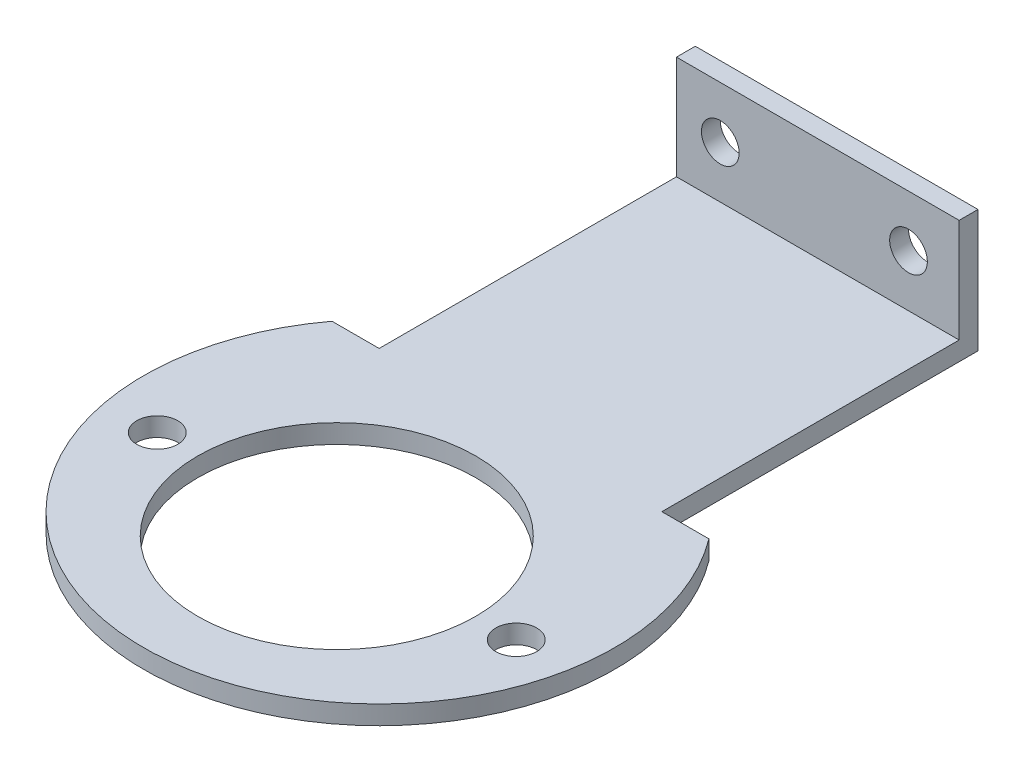
ISO-10303-21;
HEADER;
FILE_DESCRIPTION(('STEP AP214'),'2;1');
FILE_NAME('part.step','',(''),(''),'','','');
FILE_SCHEMA(('AUTOMOTIVE_DESIGN { 1 0 10303 214 1 1 1 1 }'));
ENDSEC;
DATA;
#1=APPLICATION_CONTEXT('core data for automotive mechanical design processes');
#2=APPLICATION_PROTOCOL_DEFINITION('international standard','automotive_design',2000,#1);
#3=PRODUCT_CONTEXT('',#1,'mechanical');
#4=PRODUCT('Part','Part','',(#3));
#5=PRODUCT_RELATED_PRODUCT_CATEGORY('part','',(#4));
#6=PRODUCT_DEFINITION_FORMATION('','',#4);
#7=PRODUCT_DEFINITION_CONTEXT('part definition',#1,'design');
#8=PRODUCT_DEFINITION('design','',#6,#7);
#9=PRODUCT_DEFINITION_SHAPE('','',#8);
#10=(LENGTH_UNIT() NAMED_UNIT(*) SI_UNIT(.MILLI.,.METRE.));
#11=(NAMED_UNIT(*) PLANE_ANGLE_UNIT() SI_UNIT($,.RADIAN.));
#12=(NAMED_UNIT(*) SI_UNIT($,.STERADIAN.) SOLID_ANGLE_UNIT());
#13=UNCERTAINTY_MEASURE_WITH_UNIT(LENGTH_MEASURE(1.E-05),#10,'distance_accuracy_value','');
#14=(GEOMETRIC_REPRESENTATION_CONTEXT(3) GLOBAL_UNCERTAINTY_ASSIGNED_CONTEXT((#13)) GLOBAL_UNIT_ASSIGNED_CONTEXT((#10,
#11,#12)) REPRESENTATION_CONTEXT('',''));
#15=CARTESIAN_POINT('',(0.,0.,0.));
#16=DIRECTION('',(0.,0.,1.));
#17=DIRECTION('',(1.,0.,0.));
#18=AXIS2_PLACEMENT_3D('',#15,#16,#17);
#19=CARTESIAN_POINT('',(-40.,4.,-30.));
#20=DIRECTION('',(0.,0.,1.));
#21=DIRECTION('',(1.,0.,0.));
#22=AXIS2_PLACEMENT_3D('',#19,#20,#21);
#23=PLANE('',#22);
#24=DIRECTION('',(0.,1.,0.));
#25=VECTOR('',#24,1.);
#26=CARTESIAN_POINT('',(-30.,4.,-30.));
#27=LINE('',#26,#25);
#28=CARTESIAN_POINT('',(-30.,0.,-30.));
#29=VERTEX_POINT('',#28);
#30=CARTESIAN_POINT('',(-30.,4.,-30.));
#31=VERTEX_POINT('',#30);
#32=EDGE_CURVE('E137',#29,#31,#27,.T.);
#33=ORIENTED_EDGE('',*,*,#32,.F.);
#34=DIRECTION('',(-1.,0.,0.));
#35=VECTOR('',#34,1.);
#36=CARTESIAN_POINT('',(-40.,0.,-30.));
#37=LINE('',#36,#35);
#38=CARTESIAN_POINT('',(-40.,0.,-30.));
#39=VERTEX_POINT('',#38);
#40=EDGE_CURVE('E199',#29,#39,#37,.T.);
#41=ORIENTED_EDGE('',*,*,#40,.T.);
#42=DIRECTION('',(0.,-1.,0.));
#43=VECTOR('',#42,1.);
#44=CARTESIAN_POINT('',(-40.,4.,-30.));
#45=LINE('',#44,#43);
#46=CARTESIAN_POINT('',(-40.,4.,-30.));
#47=VERTEX_POINT('',#46);
#48=EDGE_CURVE('E55',#47,#39,#45,.T.);
#49=ORIENTED_EDGE('',*,*,#48,.F.);
#50=DIRECTION('',(-1.,0.,0.));
#51=VECTOR('',#50,1.);
#52=CARTESIAN_POINT('',(-40.,4.,-30.));
#53=LINE('',#52,#51);
#54=EDGE_CURVE('E191',#31,#47,#53,.T.);
#55=ORIENTED_EDGE('',*,*,#54,.F.);
#56=EDGE_LOOP('',(#33,#41,#49,#55));
#57=FACE_BOUND('',#56,.T.);
#58=ADVANCED_FACE('F45',(#57),#23,.F.);
#59=DIRECTION('',(0.,-1.,0.));
#60=VECTOR('',#59,1.);
#61=CARTESIAN_POINT('',(30.,4.,-30.));
#62=LINE('',#61,#60);
#63=CARTESIAN_POINT('',(30.,4.,-30.));
#64=VERTEX_POINT('',#63);
#65=CARTESIAN_POINT('',(30.,0.,-30.));
#66=VERTEX_POINT('',#65);
#67=EDGE_CURVE('E141',#64,#66,#62,.T.);
#68=ORIENTED_EDGE('',*,*,#67,.F.);
#69=CARTESIAN_POINT('',(40.,4.,-30.));
#70=VERTEX_POINT('',#69);
#71=EDGE_CURVE('E193',#70,#64,#53,.T.);
#72=ORIENTED_EDGE('',*,*,#71,.F.);
#73=DIRECTION('',(0.,-1.,0.));
#74=VECTOR('',#73,1.);
#75=CARTESIAN_POINT('',(40.,4.,-30.));
#76=LINE('',#75,#74);
#77=CARTESIAN_POINT('',(40.,0.,-30.));
#78=VERTEX_POINT('',#77);
#79=EDGE_CURVE('E11',#70,#78,#76,.T.);
#80=ORIENTED_EDGE('',*,*,#79,.T.);
#81=EDGE_CURVE('E192',#78,#66,#37,.T.);
#82=ORIENTED_EDGE('',*,*,#81,.T.);
#83=EDGE_LOOP('',(#68,#72,#80,#82));
#84=FACE_BOUND('',#83,.T.);
#85=ADVANCED_FACE('F251',(#84),#23,.F.);
#86=CARTESIAN_POINT('',(0.,4.,0.));
#87=DIRECTION('',(0.,-1.,0.));
#88=DIRECTION('',(0.,0.,-1.));
#89=AXIS2_PLACEMENT_3D('',#86,#87,#88);
#90=CYLINDRICAL_SURFACE('',#89,50.);
#91=CARTESIAN_POINT('',(0.,0.,0.));
#92=DIRECTION('',(0.,1.,0.));
#93=DIRECTION('',(0.,0.,-1.));
#94=AXIS2_PLACEMENT_3D('',#91,#92,#93);
#95=CIRCLE('',#94,50.);
#96=EDGE_CURVE('E176',#39,#78,#95,.T.);
#97=ORIENTED_EDGE('',*,*,#96,.T.);
#98=ORIENTED_EDGE('',*,*,#79,.F.);
#99=CARTESIAN_POINT('',(6.03683769639929E-13,4.,1.96023752785379E-13));
#100=DIRECTION('',(0.,1.,0.));
#101=DIRECTION('',(0.,0.,1.));
#102=AXIS2_PLACEMENT_3D('',#99,#100,#101);
#103=CIRCLE('',#102,50.0000000000006);
#104=EDGE_CURVE('E188',#47,#70,#103,.T.);
#105=ORIENTED_EDGE('',*,*,#104,.F.);
#106=ORIENTED_EDGE('',*,*,#48,.T.);
#107=EDGE_LOOP('',(#97,#98,#105,#106));
#108=FACE_BOUND('',#107,.T.);
#109=ADVANCED_FACE('F47',(#108),#90,.T.);
#110=CARTESIAN_POINT('',(6.03683769639929E-13,4.,1.96023752785379E-13));
#111=DIRECTION('',(0.,1.,0.));
#112=DIRECTION('',(0.,0.,1.));
#113=AXIS2_PLACEMENT_3D('',#110,#111,#112);
#114=PLANE('',#113);
#115=CARTESIAN_POINT('',(0.,4.,9.));
#116=DIRECTION('',(0.,1.,0.));
#117=DIRECTION('',(0.,0.,1.));
#118=AXIS2_PLACEMENT_3D('',#115,#116,#117);
#119=CIRCLE('',#118,29.5);
#120=CARTESIAN_POINT('',(0.,4.,38.5));
#121=VERTEX_POINT('',#120);
#122=EDGE_CURVE('E227',#121,#121,#119,.T.);
#123=ORIENTED_EDGE('',*,*,#122,.F.);
#124=EDGE_LOOP('',(#123));
#125=FACE_BOUND('',#124,.T.);
#126=DIRECTION('',(1.,0.,0.));
#127=VECTOR('',#126,1.);
#128=CARTESIAN_POINT('',(-30.,4.,-93.1));
#129=LINE('',#128,#127);
#130=CARTESIAN_POINT('',(-30.,4.,-93.1));
#131=VERTEX_POINT('',#130);
#132=CARTESIAN_POINT('',(30.,4.,-93.1));
#133=VERTEX_POINT('',#132);
#134=EDGE_CURVE('E63',#131,#133,#129,.T.);
#135=ORIENTED_EDGE('',*,*,#134,.F.);
#136=DIRECTION('',(0.,0.,1.));
#137=VECTOR('',#136,1.);
#138=CARTESIAN_POINT('',(-30.,4.,-97.1));
#139=LINE('',#138,#137);
#140=EDGE_CURVE('E67',#131,#31,#139,.T.);
#141=ORIENTED_EDGE('',*,*,#140,.T.);
#142=ORIENTED_EDGE('',*,*,#54,.T.);
#143=ORIENTED_EDGE('',*,*,#104,.T.);
#144=ORIENTED_EDGE('',*,*,#71,.T.);
#145=DIRECTION('',(0.,0.,1.));
#146=VECTOR('',#145,1.);
#147=CARTESIAN_POINT('',(30.,4.,-97.1));
#148=LINE('',#147,#146);
#149=EDGE_CURVE('E166',#133,#64,#148,.T.);
#150=ORIENTED_EDGE('',*,*,#149,.F.);
#151=EDGE_LOOP('',(#135,#141,#142,#143,#144,#150));
#152=FACE_BOUND('',#151,.T.);
#153=CARTESIAN_POINT('',(-38.1,4.,9.00000000000001));
#154=DIRECTION('',(0.,1.,0.));
#155=DIRECTION('',(0.,0.,1.));
#156=AXIS2_PLACEMENT_3D('',#153,#154,#155);
#157=CIRCLE('',#156,4.35);
#158=CARTESIAN_POINT('',(-38.1,4.,13.35));
#159=VERTEX_POINT('',#158);
#160=EDGE_CURVE('E177',#159,#159,#157,.T.);
#161=ORIENTED_EDGE('',*,*,#160,.F.);
#162=EDGE_LOOP('',(#161));
#163=FACE_BOUND('',#162,.T.);
#164=CARTESIAN_POINT('',(38.1,4.,9.00000000000001));
#165=DIRECTION('',(0.,1.,0.));
#166=DIRECTION('',(0.,0.,1.));
#167=AXIS2_PLACEMENT_3D('',#164,#165,#166);
#168=CIRCLE('',#167,4.35);
#169=CARTESIAN_POINT('',(38.1,4.,13.35));
#170=VERTEX_POINT('',#169);
#171=EDGE_CURVE('E181',#170,#170,#168,.T.);
#172=ORIENTED_EDGE('',*,*,#171,.F.);
#173=EDGE_LOOP('',(#172));
#174=FACE_BOUND('',#173,.T.);
#175=ADVANCED_FACE('F262',(#125,#152,#163,#174),#114,.T.);
#176=CARTESIAN_POINT('',(6.03683769639929E-13,0.,1.96023752785379E-13));
#177=DIRECTION('',(0.,1.,0.));
#178=DIRECTION('',(0.,0.,1.));
#179=AXIS2_PLACEMENT_3D('',#176,#177,#178);
#180=PLANE('',#179);
#181=CARTESIAN_POINT('',(0.,0.,9.));
#182=DIRECTION('',(0.,1.,0.));
#183=DIRECTION('',(0.,0.,1.));
#184=AXIS2_PLACEMENT_3D('',#181,#182,#183);
#185=CIRCLE('',#184,29.5);
#186=CARTESIAN_POINT('',(0.,0.,38.5));
#187=VERTEX_POINT('',#186);
#188=EDGE_CURVE('E49',#187,#187,#185,.T.);
#189=ORIENTED_EDGE('',*,*,#188,.T.);
#190=EDGE_LOOP('',(#189));
#191=FACE_BOUND('',#190,.T.);
#192=CARTESIAN_POINT('',(-38.1,0.,9.00000000000001));
#193=DIRECTION('',(0.,1.,0.));
#194=DIRECTION('',(0.,0.,1.));
#195=AXIS2_PLACEMENT_3D('',#192,#193,#194);
#196=CIRCLE('',#195,4.35);
#197=CARTESIAN_POINT('',(-38.1,0.,13.35));
#198=VERTEX_POINT('',#197);
#199=EDGE_CURVE('E172',#198,#198,#196,.T.);
#200=ORIENTED_EDGE('',*,*,#199,.T.);
#201=EDGE_LOOP('',(#200));
#202=FACE_BOUND('',#201,.T.);
#203=CARTESIAN_POINT('',(38.1,0.,9.00000000000001));
#204=DIRECTION('',(0.,1.,0.));
#205=DIRECTION('',(0.,0.,1.));
#206=AXIS2_PLACEMENT_3D('',#203,#204,#205);
#207=CIRCLE('',#206,4.35);
#208=CARTESIAN_POINT('',(38.1,0.,13.35));
#209=VERTEX_POINT('',#208);
#210=EDGE_CURVE('E171',#209,#209,#207,.T.);
#211=ORIENTED_EDGE('',*,*,#210,.T.);
#212=EDGE_LOOP('',(#211));
#213=FACE_BOUND('',#212,.T.);
#214=ORIENTED_EDGE('',*,*,#96,.F.);
#215=ORIENTED_EDGE('',*,*,#40,.F.);
#216=DIRECTION('',(0.,0.,1.));
#217=VECTOR('',#216,1.);
#218=CARTESIAN_POINT('',(-30.,0.,-97.1));
#219=LINE('',#218,#217);
#220=CARTESIAN_POINT('',(-30.,0.,-97.1));
#221=VERTEX_POINT('',#220);
#222=EDGE_CURVE('E154',#221,#29,#219,.T.);
#223=ORIENTED_EDGE('',*,*,#222,.F.);
#224=DIRECTION('',(-1.,0.,0.));
#225=VECTOR('',#224,1.);
#226=CARTESIAN_POINT('',(30.,0.,-97.1));
#227=LINE('',#226,#225);
#228=CARTESIAN_POINT('',(30.,0.,-97.1));
#229=VERTEX_POINT('',#228);
#230=EDGE_CURVE('E152',#229,#221,#227,.T.);
#231=ORIENTED_EDGE('',*,*,#230,.F.);
#232=DIRECTION('',(0.,0.,1.));
#233=VECTOR('',#232,1.);
#234=CARTESIAN_POINT('',(30.,0.,-97.1));
#235=LINE('',#234,#233);
#236=EDGE_CURVE('E162',#229,#66,#235,.T.);
#237=ORIENTED_EDGE('',*,*,#236,.T.);
#238=ORIENTED_EDGE('',*,*,#81,.F.);
#239=EDGE_LOOP('',(#214,#215,#223,#231,#237,#238));
#240=FACE_BOUND('',#239,.T.);
#241=ADVANCED_FACE('F236',(#191,#202,#213,#240),#180,.F.);
#242=CARTESIAN_POINT('',(38.1,0.,9.00000000000001));
#243=DIRECTION('',(0.,1.,0.));
#244=DIRECTION('',(0.,0.,1.));
#245=AXIS2_PLACEMENT_3D('',#242,#243,#244);
#246=CYLINDRICAL_SURFACE('',#245,4.35);
#247=ORIENTED_EDGE('',*,*,#210,.F.);
#248=EDGE_LOOP('',(#247));
#249=FACE_BOUND('',#248,.T.);
#250=ORIENTED_EDGE('',*,*,#171,.T.);
#251=EDGE_LOOP('',(#250));
#252=FACE_BOUND('',#251,.T.);
#253=ADVANCED_FACE('F261',(#249,#252),#246,.F.);
#254=CARTESIAN_POINT('',(-38.1,0.,9.00000000000001));
#255=DIRECTION('',(0.,1.,0.));
#256=DIRECTION('',(0.,0.,1.));
#257=AXIS2_PLACEMENT_3D('',#254,#255,#256);
#258=CYLINDRICAL_SURFACE('',#257,4.35);
#259=ORIENTED_EDGE('',*,*,#199,.F.);
#260=EDGE_LOOP('',(#259));
#261=FACE_BOUND('',#260,.T.);
#262=ORIENTED_EDGE('',*,*,#160,.T.);
#263=EDGE_LOOP('',(#262));
#264=FACE_BOUND('',#263,.T.);
#265=ADVANCED_FACE('F268',(#261,#264),#258,.F.);
#266=CARTESIAN_POINT('',(-30.,4.,-97.1));
#267=DIRECTION('',(1.,0.,0.));
#268=DIRECTION('',(0.,0.,-1.));
#269=AXIS2_PLACEMENT_3D('',#266,#267,#268);
#270=PLANE('',#269);
#271=ORIENTED_EDGE('',*,*,#32,.T.);
#272=ORIENTED_EDGE('',*,*,#140,.F.);
#273=DIRECTION('',(0.,-1.,0.));
#274=VECTOR('',#273,1.);
#275=CARTESIAN_POINT('',(-30.,26.,-93.1));
#276=LINE('',#275,#274);
#277=CARTESIAN_POINT('',(-30.,26.,-93.1));
#278=VERTEX_POINT('',#277);
#279=EDGE_CURVE('E115',#278,#131,#276,.T.);
#280=ORIENTED_EDGE('',*,*,#279,.F.);
#281=DIRECTION('',(0.,0.,1.));
#282=VECTOR('',#281,1.);
#283=CARTESIAN_POINT('',(-30.,26.,-97.1));
#284=LINE('',#283,#282);
#285=CARTESIAN_POINT('',(-30.,26.,-97.1));
#286=VERTEX_POINT('',#285);
#287=EDGE_CURVE('E123',#286,#278,#284,.T.);
#288=ORIENTED_EDGE('',*,*,#287,.F.);
#289=DIRECTION('',(0.,1.,0.));
#290=VECTOR('',#289,1.);
#291=CARTESIAN_POINT('',(-30.,4.,-97.1));
#292=LINE('',#291,#290);
#293=EDGE_CURVE('E146',#221,#286,#292,.T.);
#294=ORIENTED_EDGE('',*,*,#293,.F.);
#295=ORIENTED_EDGE('',*,*,#222,.T.);
#296=EDGE_LOOP('',(#271,#272,#280,#288,#294,#295));
#297=FACE_BOUND('',#296,.T.);
#298=ADVANCED_FACE('F135',(#297),#270,.F.);
#299=CARTESIAN_POINT('',(30.,4.,-97.1));
#300=DIRECTION('',(-1.,0.,0.));
#301=DIRECTION('',(0.,0.,1.));
#302=AXIS2_PLACEMENT_3D('',#299,#300,#301);
#303=PLANE('',#302);
#304=ORIENTED_EDGE('',*,*,#67,.T.);
#305=ORIENTED_EDGE('',*,*,#236,.F.);
#306=DIRECTION('',(0.,-1.,0.));
#307=VECTOR('',#306,1.);
#308=CARTESIAN_POINT('',(30.,4.,-97.1));
#309=LINE('',#308,#307);
#310=CARTESIAN_POINT('',(30.,26.,-97.1));
#311=VERTEX_POINT('',#310);
#312=EDGE_CURVE('E149',#311,#229,#309,.T.);
#313=ORIENTED_EDGE('',*,*,#312,.F.);
#314=DIRECTION('',(0.,0.,-1.));
#315=VECTOR('',#314,1.);
#316=CARTESIAN_POINT('',(30.,26.,-97.1));
#317=LINE('',#316,#315);
#318=CARTESIAN_POINT('',(30.,26.,-93.1));
#319=VERTEX_POINT('',#318);
#320=EDGE_CURVE('E122',#319,#311,#317,.T.);
#321=ORIENTED_EDGE('',*,*,#320,.F.);
#322=DIRECTION('',(0.,-1.,0.));
#323=VECTOR('',#322,1.);
#324=CARTESIAN_POINT('',(30.,26.,-93.1));
#325=LINE('',#324,#323);
#326=EDGE_CURVE('E117',#319,#133,#325,.T.);
#327=ORIENTED_EDGE('',*,*,#326,.T.);
#328=ORIENTED_EDGE('',*,*,#149,.T.);
#329=EDGE_LOOP('',(#304,#305,#313,#321,#327,#328));
#330=FACE_BOUND('',#329,.T.);
#331=ADVANCED_FACE('F274',(#330),#303,.F.);
#332=CARTESIAN_POINT('',(0.,0.,-97.1));
#333=DIRECTION('',(0.,0.,-1.));
#334=DIRECTION('',(-1.,0.,0.));
#335=AXIS2_PLACEMENT_3D('',#332,#333,#334);
#336=PLANE('',#335);
#337=CARTESIAN_POINT('',(19.25,15.,-97.1));
#338=DIRECTION('',(0.,0.,-1.));
#339=DIRECTION('',(-1.,0.,0.));
#340=AXIS2_PLACEMENT_3D('',#337,#338,#339);
#341=CIRCLE('',#340,4.);
#342=CARTESIAN_POINT('',(15.25,15.,-97.1));
#343=VERTEX_POINT('',#342);
#344=EDGE_CURVE('E209',#343,#343,#341,.T.);
#345=ORIENTED_EDGE('',*,*,#344,.F.);
#346=EDGE_LOOP('',(#345));
#347=FACE_BOUND('',#346,.T.);
#348=CARTESIAN_POINT('',(-20.7,15.,-97.1));
#349=DIRECTION('',(0.,0.,-1.));
#350=DIRECTION('',(-1.,0.,0.));
#351=AXIS2_PLACEMENT_3D('',#348,#349,#350);
#352=CIRCLE('',#351,4.);
#353=CARTESIAN_POINT('',(-24.7,15.,-97.1));
#354=VERTEX_POINT('',#353);
#355=EDGE_CURVE('E220',#354,#354,#352,.T.);
#356=ORIENTED_EDGE('',*,*,#355,.F.);
#357=EDGE_LOOP('',(#356));
#358=FACE_BOUND('',#357,.T.);
#359=ORIENTED_EDGE('',*,*,#293,.T.);
#360=DIRECTION('',(-1.,0.,0.));
#361=VECTOR('',#360,1.);
#362=CARTESIAN_POINT('',(-30.,26.,-97.1));
#363=LINE('',#362,#361);
#364=EDGE_CURVE('E129',#311,#286,#363,.T.);
#365=ORIENTED_EDGE('',*,*,#364,.F.);
#366=ORIENTED_EDGE('',*,*,#312,.T.);
#367=ORIENTED_EDGE('',*,*,#230,.T.);
#368=EDGE_LOOP('',(#359,#365,#366,#367));
#369=FACE_BOUND('',#368,.T.);
#370=ADVANCED_FACE('F277',(#347,#358,#369),#336,.T.);
#371=CARTESIAN_POINT('',(-30.,26.,-93.1));
#372=DIRECTION('',(0.,0.,-1.));
#373=DIRECTION('',(-1.,0.,0.));
#374=AXIS2_PLACEMENT_3D('',#371,#372,#373);
#375=PLANE('',#374);
#376=CARTESIAN_POINT('',(19.25,15.,-93.1));
#377=DIRECTION('',(0.,0.,-1.));
#378=DIRECTION('',(-1.,0.,0.));
#379=AXIS2_PLACEMENT_3D('',#376,#377,#378);
#380=CIRCLE('',#379,4.);
#381=CARTESIAN_POINT('',(15.25,15.,-93.1));
#382=VERTEX_POINT('',#381);
#383=EDGE_CURVE('E208',#382,#382,#380,.T.);
#384=ORIENTED_EDGE('',*,*,#383,.T.);
#385=EDGE_LOOP('',(#384));
#386=FACE_BOUND('',#385,.T.);
#387=CARTESIAN_POINT('',(-20.7,15.,-93.1));
#388=DIRECTION('',(0.,0.,-1.));
#389=DIRECTION('',(-1.,0.,0.));
#390=AXIS2_PLACEMENT_3D('',#387,#388,#389);
#391=CIRCLE('',#390,4.);
#392=CARTESIAN_POINT('',(-24.7,15.,-93.1));
#393=VERTEX_POINT('',#392);
#394=EDGE_CURVE('E205',#393,#393,#391,.T.);
#395=ORIENTED_EDGE('',*,*,#394,.T.);
#396=EDGE_LOOP('',(#395));
#397=FACE_BOUND('',#396,.T.);
#398=ORIENTED_EDGE('',*,*,#134,.T.);
#399=ORIENTED_EDGE('',*,*,#326,.F.);
#400=DIRECTION('',(1.,0.,0.));
#401=VECTOR('',#400,1.);
#402=CARTESIAN_POINT('',(-30.,26.,-93.1));
#403=LINE('',#402,#401);
#404=EDGE_CURVE('E111',#278,#319,#403,.T.);
#405=ORIENTED_EDGE('',*,*,#404,.F.);
#406=ORIENTED_EDGE('',*,*,#279,.T.);
#407=EDGE_LOOP('',(#398,#399,#405,#406));
#408=FACE_BOUND('',#407,.T.);
#409=ADVANCED_FACE('F113',(#386,#397,#408),#375,.F.);
#410=CARTESIAN_POINT('',(0.,26.,0.));
#411=DIRECTION('',(0.,1.,0.));
#412=DIRECTION('',(0.,0.,1.));
#413=AXIS2_PLACEMENT_3D('',#410,#411,#412);
#414=PLANE('',#413);
#415=ORIENTED_EDGE('',*,*,#287,.T.);
#416=ORIENTED_EDGE('',*,*,#404,.T.);
#417=ORIENTED_EDGE('',*,*,#320,.T.);
#418=ORIENTED_EDGE('',*,*,#364,.T.);
#419=EDGE_LOOP('',(#415,#416,#417,#418));
#420=FACE_BOUND('',#419,.T.);
#421=ADVANCED_FACE('F127',(#420),#414,.T.);
#422=CARTESIAN_POINT('',(-20.7,15.,-77.1));
#423=DIRECTION('',(0.,0.,-1.));
#424=DIRECTION('',(-1.,0.,0.));
#425=AXIS2_PLACEMENT_3D('',#422,#423,#424);
#426=CYLINDRICAL_SURFACE('',#425,4.);
#427=ORIENTED_EDGE('',*,*,#355,.T.);
#428=EDGE_LOOP('',(#427));
#429=FACE_BOUND('',#428,.T.);
#430=ORIENTED_EDGE('',*,*,#394,.F.);
#431=EDGE_LOOP('',(#430));
#432=FACE_BOUND('',#431,.T.);
#433=ADVANCED_FACE('F247',(#429,#432),#426,.F.);
#434=CARTESIAN_POINT('',(19.25,15.,-77.1));
#435=DIRECTION('',(0.,0.,-1.));
#436=DIRECTION('',(-1.,0.,0.));
#437=AXIS2_PLACEMENT_3D('',#434,#435,#436);
#438=CYLINDRICAL_SURFACE('',#437,4.);
#439=ORIENTED_EDGE('',*,*,#344,.T.);
#440=EDGE_LOOP('',(#439));
#441=FACE_BOUND('',#440,.T.);
#442=ORIENTED_EDGE('',*,*,#383,.F.);
#443=EDGE_LOOP('',(#442));
#444=FACE_BOUND('',#443,.T.);
#445=ADVANCED_FACE('F241',(#441,#444),#438,.F.);
#446=CARTESIAN_POINT('',(0.,-6.,9.));
#447=DIRECTION('',(0.,1.,0.));
#448=DIRECTION('',(0.,0.,1.));
#449=AXIS2_PLACEMENT_3D('',#446,#447,#448);
#450=CYLINDRICAL_SURFACE('',#449,29.5);
#451=ORIENTED_EDGE('',*,*,#122,.T.);
#452=EDGE_LOOP('',(#451));
#453=FACE_BOUND('',#452,.T.);
#454=ORIENTED_EDGE('',*,*,#188,.F.);
#455=EDGE_LOOP('',(#454));
#456=FACE_BOUND('',#455,.T.);
#457=ADVANCED_FACE('F239',(#453,#456),#450,.F.);
#458=CLOSED_SHELL('',(#58,#85,#109,#175,#241,#253,#265,#298,#331,#370,#409,#421,#433,#445,#457));
#459=MANIFOLD_SOLID_BREP('B2',#458);
#460=ADVANCED_BREP_SHAPE_REPRESENTATION('',(#18,#459),#14);
#461=SHAPE_DEFINITION_REPRESENTATION(#9,#460);
ENDSEC;
END-ISO-10303-21;
